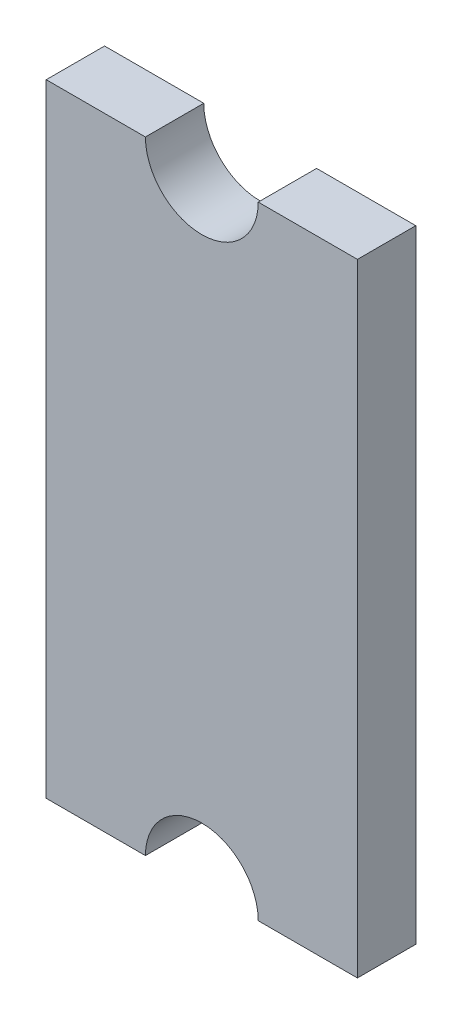
ISO-10303-21;
HEADER;
FILE_DESCRIPTION(('STEP AP214'),'2;1');
FILE_NAME('part.step','',(''),(''),'','','');
FILE_SCHEMA(('AUTOMOTIVE_DESIGN { 1 0 10303 214 1 1 1 1 }'));
ENDSEC;
DATA;
#1=APPLICATION_CONTEXT('core data for automotive mechanical design processes');
#2=APPLICATION_PROTOCOL_DEFINITION('international standard','automotive_design',2000,#1);
#3=PRODUCT_CONTEXT('',#1,'mechanical');
#4=PRODUCT('Part','Part','',(#3));
#5=PRODUCT_RELATED_PRODUCT_CATEGORY('part','',(#4));
#6=PRODUCT_DEFINITION_FORMATION('','',#4);
#7=PRODUCT_DEFINITION_CONTEXT('part definition',#1,'design');
#8=PRODUCT_DEFINITION('design','',#6,#7);
#9=PRODUCT_DEFINITION_SHAPE('','',#8);
#10=(LENGTH_UNIT() NAMED_UNIT(*) SI_UNIT(.MILLI.,.METRE.));
#11=(NAMED_UNIT(*) PLANE_ANGLE_UNIT() SI_UNIT($,.RADIAN.));
#12=(NAMED_UNIT(*) SI_UNIT($,.STERADIAN.) SOLID_ANGLE_UNIT());
#13=UNCERTAINTY_MEASURE_WITH_UNIT(LENGTH_MEASURE(1.E-05),#10,'distance_accuracy_value','');
#14=(GEOMETRIC_REPRESENTATION_CONTEXT(3) GLOBAL_UNCERTAINTY_ASSIGNED_CONTEXT((#13)) GLOBAL_UNIT_ASSIGNED_CONTEXT((#10,
#11,#12)) REPRESENTATION_CONTEXT('',''));
#15=CARTESIAN_POINT('',(0.,0.,0.));
#16=DIRECTION('',(0.,0.,1.));
#17=DIRECTION('',(1.,0.,0.));
#18=AXIS2_PLACEMENT_3D('',#15,#16,#17);
#19=CARTESIAN_POINT('',(0.,0.,0.15));
#20=DIRECTION('',(0.,0.,1.));
#21=DIRECTION('',(1.,0.,0.));
#22=AXIS2_PLACEMENT_3D('',#19,#20,#21);
#23=PLANE('',#22);
#24=DIRECTION('',(-1.,0.,0.));
#25=VECTOR('',#24,1.);
#26=CARTESIAN_POINT('',(-0.145,0.8,0.15));
#27=LINE('',#26,#25);
#28=CARTESIAN_POINT('',(-0.145,0.8,0.15));
#29=VERTEX_POINT('',#28);
#30=CARTESIAN_POINT('',(-0.4,0.8,0.15));
#31=VERTEX_POINT('',#30);
#32=EDGE_CURVE('E270',#29,#31,#27,.T.);
#33=ORIENTED_EDGE('',*,*,#32,.T.);
#34=DIRECTION('',(0.,-1.,0.));
#35=VECTOR('',#34,1.);
#36=CARTESIAN_POINT('',(-0.4,0.8,0.15));
#37=LINE('',#36,#35);
#38=CARTESIAN_POINT('',(-0.4,-0.8,0.15));
#39=VERTEX_POINT('',#38);
#40=EDGE_CURVE('E134',#31,#39,#37,.T.);
#41=ORIENTED_EDGE('',*,*,#40,.T.);
#42=DIRECTION('',(1.,0.,0.));
#43=VECTOR('',#42,1.);
#44=CARTESIAN_POINT('',(-0.4,-0.8,0.15));
#45=LINE('',#44,#43);
#46=CARTESIAN_POINT('',(-0.145,-0.8,0.15));
#47=VERTEX_POINT('',#46);
#48=EDGE_CURVE('E127',#39,#47,#45,.T.);
#49=ORIENTED_EDGE('',*,*,#48,.T.);
#50=CARTESIAN_POINT('',(0.,-0.8,0.15));
#51=DIRECTION('',(0.,0.,1.));
#52=DIRECTION('',(1.,0.,0.));
#53=AXIS2_PLACEMENT_3D('',#50,#51,#52);
#54=CIRCLE('',#53,0.145);
#55=CARTESIAN_POINT('',(0.145,-0.8,0.15));
#56=VERTEX_POINT('',#55);
#57=EDGE_CURVE('E118',#56,#47,#54,.T.);
#58=ORIENTED_EDGE('',*,*,#57,.F.);
#59=DIRECTION('',(1.,0.,0.));
#60=VECTOR('',#59,1.);
#61=CARTESIAN_POINT('',(0.145,-0.8,0.15));
#62=LINE('',#61,#60);
#63=CARTESIAN_POINT('',(0.4,-0.8,0.15));
#64=VERTEX_POINT('',#63);
#65=EDGE_CURVE('E150',#56,#64,#62,.T.);
#66=ORIENTED_EDGE('',*,*,#65,.T.);
#67=DIRECTION('',(0.,1.,0.));
#68=VECTOR('',#67,1.);
#69=CARTESIAN_POINT('',(0.4,-0.8,0.15));
#70=LINE('',#69,#68);
#71=CARTESIAN_POINT('',(0.4,0.8,0.15));
#72=VERTEX_POINT('',#71);
#73=EDGE_CURVE('E68',#64,#72,#70,.T.);
#74=ORIENTED_EDGE('',*,*,#73,.T.);
#75=DIRECTION('',(-1.,0.,0.));
#76=VECTOR('',#75,1.);
#77=CARTESIAN_POINT('',(0.4,0.8,0.15));
#78=LINE('',#77,#76);
#79=CARTESIAN_POINT('',(0.145,0.8,0.15));
#80=VERTEX_POINT('',#79);
#81=EDGE_CURVE('E166',#72,#80,#78,.T.);
#82=ORIENTED_EDGE('',*,*,#81,.T.);
#83=CARTESIAN_POINT('',(0.,0.8,0.15));
#84=DIRECTION('',(0.,0.,1.));
#85=DIRECTION('',(1.,0.,0.));
#86=AXIS2_PLACEMENT_3D('',#83,#84,#85);
#87=CIRCLE('',#86,0.145);
#88=EDGE_CURVE('E26',#29,#80,#87,.T.);
#89=ORIENTED_EDGE('',*,*,#88,.F.);
#90=EDGE_LOOP('',(#33,#41,#49,#58,#66,#74,#82,#89));
#91=FACE_BOUND('',#90,.T.);
#92=ADVANCED_FACE('F17',(#91),#23,.T.);
#93=CARTESIAN_POINT('',(0.,0.,0.));
#94=DIRECTION('',(0.,0.,1.));
#95=DIRECTION('',(1.,0.,0.));
#96=AXIS2_PLACEMENT_3D('',#93,#94,#95);
#97=PLANE('',#96);
#98=DIRECTION('',(-1.,0.,0.));
#99=VECTOR('',#98,1.);
#100=CARTESIAN_POINT('',(-0.145,0.8,0.));
#101=LINE('',#100,#99);
#102=CARTESIAN_POINT('',(-0.145,0.8,0.));
#103=VERTEX_POINT('',#102);
#104=CARTESIAN_POINT('',(-0.4,0.8,0.));
#105=VERTEX_POINT('',#104);
#106=EDGE_CURVE('E267',#103,#105,#101,.T.);
#107=ORIENTED_EDGE('',*,*,#106,.F.);
#108=CARTESIAN_POINT('',(0.,0.8,0.));
#109=DIRECTION('',(0.,0.,1.));
#110=DIRECTION('',(1.,0.,0.));
#111=AXIS2_PLACEMENT_3D('',#108,#109,#110);
#112=CIRCLE('',#111,0.145);
#113=CARTESIAN_POINT('',(0.145,0.8,0.));
#114=VERTEX_POINT('',#113);
#115=EDGE_CURVE('E11',#103,#114,#112,.T.);
#116=ORIENTED_EDGE('',*,*,#115,.T.);
#117=DIRECTION('',(-1.,0.,0.));
#118=VECTOR('',#117,1.);
#119=CARTESIAN_POINT('',(0.4,0.8,0.));
#120=LINE('',#119,#118);
#121=CARTESIAN_POINT('',(0.4,0.8,0.));
#122=VERTEX_POINT('',#121);
#123=EDGE_CURVE('E58',#122,#114,#120,.T.);
#124=ORIENTED_EDGE('',*,*,#123,.F.);
#125=DIRECTION('',(0.,1.,0.));
#126=VECTOR('',#125,1.);
#127=CARTESIAN_POINT('',(0.4,-0.8,0.));
#128=LINE('',#127,#126);
#129=CARTESIAN_POINT('',(0.4,-0.8,0.));
#130=VERTEX_POINT('',#129);
#131=EDGE_CURVE('E78',#130,#122,#128,.T.);
#132=ORIENTED_EDGE('',*,*,#131,.F.);
#133=DIRECTION('',(1.,0.,0.));
#134=VECTOR('',#133,1.);
#135=CARTESIAN_POINT('',(0.145,-0.8,0.));
#136=LINE('',#135,#134);
#137=CARTESIAN_POINT('',(0.145,-0.8,0.));
#138=VERTEX_POINT('',#137);
#139=EDGE_CURVE('E113',#138,#130,#136,.T.);
#140=ORIENTED_EDGE('',*,*,#139,.F.);
#141=CARTESIAN_POINT('',(0.,-0.8,0.));
#142=DIRECTION('',(0.,0.,1.));
#143=DIRECTION('',(1.,0.,0.));
#144=AXIS2_PLACEMENT_3D('',#141,#142,#143);
#145=CIRCLE('',#144,0.145);
#146=CARTESIAN_POINT('',(-0.145,-0.8,0.));
#147=VERTEX_POINT('',#146);
#148=EDGE_CURVE('E106',#138,#147,#145,.T.);
#149=ORIENTED_EDGE('',*,*,#148,.T.);
#150=DIRECTION('',(1.,0.,0.));
#151=VECTOR('',#150,1.);
#152=CARTESIAN_POINT('',(-0.4,-0.8,0.));
#153=LINE('',#152,#151);
#154=CARTESIAN_POINT('',(-0.4,-0.8,0.));
#155=VERTEX_POINT('',#154);
#156=EDGE_CURVE('E110',#155,#147,#153,.T.);
#157=ORIENTED_EDGE('',*,*,#156,.F.);
#158=DIRECTION('',(0.,-1.,0.));
#159=VECTOR('',#158,1.);
#160=CARTESIAN_POINT('',(-0.4,0.8,0.));
#161=LINE('',#160,#159);
#162=EDGE_CURVE('E264',#105,#155,#161,.T.);
#163=ORIENTED_EDGE('',*,*,#162,.F.);
#164=EDGE_LOOP('',(#107,#116,#124,#132,#140,#149,#157,#163));
#165=FACE_BOUND('',#164,.T.);
#166=ADVANCED_FACE('F19',(#165),#97,.F.);
#167=CARTESIAN_POINT('',(0.,0.8,0.));
#168=DIRECTION('',(0.,0.,-1.));
#169=DIRECTION('',(1.,0.,0.));
#170=AXIS2_PLACEMENT_3D('',#167,#168,#169);
#171=CYLINDRICAL_SURFACE('',#170,0.145);
#172=DIRECTION('',(0.,0.,1.));
#173=VECTOR('',#172,1.);
#174=CARTESIAN_POINT('',(-0.145,0.8,0.));
#175=LINE('',#174,#173);
#176=EDGE_CURVE('E277',#103,#29,#175,.T.);
#177=ORIENTED_EDGE('',*,*,#176,.T.);
#178=ORIENTED_EDGE('',*,*,#88,.T.);
#179=DIRECTION('',(0.,0.,1.));
#180=VECTOR('',#179,1.);
#181=CARTESIAN_POINT('',(0.145,0.8,0.));
#182=LINE('',#181,#180);
#183=EDGE_CURVE('E156',#114,#80,#182,.T.);
#184=ORIENTED_EDGE('',*,*,#183,.F.);
#185=ORIENTED_EDGE('',*,*,#115,.F.);
#186=EDGE_LOOP('',(#177,#178,#184,#185));
#187=FACE_BOUND('',#186,.T.);
#188=ADVANCED_FACE('F202',(#187),#171,.F.);
#189=CARTESIAN_POINT('',(0.4,0.8,0.));
#190=DIRECTION('',(0.,-1.,0.));
#191=DIRECTION('',(0.,0.,-1.));
#192=AXIS2_PLACEMENT_3D('',#189,#190,#191);
#193=PLANE('',#192);
#194=DIRECTION('',(0.,0.,1.));
#195=VECTOR('',#194,1.);
#196=CARTESIAN_POINT('',(0.4,0.8,0.));
#197=LINE('',#196,#195);
#198=EDGE_CURVE('E149',#122,#72,#197,.T.);
#199=ORIENTED_EDGE('',*,*,#198,.F.);
#200=ORIENTED_EDGE('',*,*,#123,.T.);
#201=ORIENTED_EDGE('',*,*,#183,.T.);
#202=ORIENTED_EDGE('',*,*,#81,.F.);
#203=EDGE_LOOP('',(#199,#200,#201,#202));
#204=FACE_BOUND('',#203,.T.);
#205=ADVANCED_FACE('F196',(#204),#193,.F.);
#206=CARTESIAN_POINT('',(0.4,-0.8,0.));
#207=DIRECTION('',(-1.,0.,0.));
#208=DIRECTION('',(0.,0.,1.));
#209=AXIS2_PLACEMENT_3D('',#206,#207,#208);
#210=PLANE('',#209);
#211=DIRECTION('',(0.,0.,1.));
#212=VECTOR('',#211,1.);
#213=CARTESIAN_POINT('',(0.4,-0.8,0.));
#214=LINE('',#213,#212);
#215=EDGE_CURVE('E146',#130,#64,#214,.T.);
#216=ORIENTED_EDGE('',*,*,#215,.F.);
#217=ORIENTED_EDGE('',*,*,#131,.T.);
#218=ORIENTED_EDGE('',*,*,#198,.T.);
#219=ORIENTED_EDGE('',*,*,#73,.F.);
#220=EDGE_LOOP('',(#216,#217,#218,#219));
#221=FACE_BOUND('',#220,.T.);
#222=ADVANCED_FACE('F201',(#221),#210,.F.);
#223=CARTESIAN_POINT('',(0.145,-0.8,0.));
#224=DIRECTION('',(0.,1.,0.));
#225=DIRECTION('',(1.,0.,0.));
#226=AXIS2_PLACEMENT_3D('',#223,#224,#225);
#227=PLANE('',#226);
#228=DIRECTION('',(0.,0.,1.));
#229=VECTOR('',#228,1.);
#230=CARTESIAN_POINT('',(0.145,-0.8,0.));
#231=LINE('',#230,#229);
#232=EDGE_CURVE('E287',#138,#56,#231,.T.);
#233=ORIENTED_EDGE('',*,*,#232,.F.);
#234=ORIENTED_EDGE('',*,*,#139,.T.);
#235=ORIENTED_EDGE('',*,*,#215,.T.);
#236=ORIENTED_EDGE('',*,*,#65,.F.);
#237=EDGE_LOOP('',(#233,#234,#235,#236));
#238=FACE_BOUND('',#237,.T.);
#239=ADVANCED_FACE('F227',(#238),#227,.F.);
#240=CARTESIAN_POINT('',(0.,-0.8,0.));
#241=DIRECTION('',(0.,0.,-1.));
#242=DIRECTION('',(1.,0.,0.));
#243=AXIS2_PLACEMENT_3D('',#240,#241,#242);
#244=CYLINDRICAL_SURFACE('',#243,0.145);
#245=ORIENTED_EDGE('',*,*,#232,.T.);
#246=ORIENTED_EDGE('',*,*,#57,.T.);
#247=DIRECTION('',(0.,0.,1.));
#248=VECTOR('',#247,1.);
#249=CARTESIAN_POINT('',(-0.145,-0.8,0.));
#250=LINE('',#249,#248);
#251=EDGE_CURVE('E121',#147,#47,#250,.T.);
#252=ORIENTED_EDGE('',*,*,#251,.F.);
#253=ORIENTED_EDGE('',*,*,#148,.F.);
#254=EDGE_LOOP('',(#245,#246,#252,#253));
#255=FACE_BOUND('',#254,.T.);
#256=ADVANCED_FACE('F122',(#255),#244,.F.);
#257=CARTESIAN_POINT('',(-0.4,-0.8,0.));
#258=DIRECTION('',(0.,1.,0.));
#259=DIRECTION('',(1.,0.,0.));
#260=AXIS2_PLACEMENT_3D('',#257,#258,#259);
#261=PLANE('',#260);
#262=DIRECTION('',(0.,0.,1.));
#263=VECTOR('',#262,1.);
#264=CARTESIAN_POINT('',(-0.4,-0.8,0.));
#265=LINE('',#264,#263);
#266=EDGE_CURVE('E131',#155,#39,#265,.T.);
#267=ORIENTED_EDGE('',*,*,#266,.F.);
#268=ORIENTED_EDGE('',*,*,#156,.T.);
#269=ORIENTED_EDGE('',*,*,#251,.T.);
#270=ORIENTED_EDGE('',*,*,#48,.F.);
#271=EDGE_LOOP('',(#267,#268,#269,#270));
#272=FACE_BOUND('',#271,.T.);
#273=ADVANCED_FACE('F129',(#272),#261,.F.);
#274=CARTESIAN_POINT('',(-0.4,0.8,0.));
#275=DIRECTION('',(1.,0.,0.));
#276=DIRECTION('',(0.,1.,0.));
#277=AXIS2_PLACEMENT_3D('',#274,#275,#276);
#278=PLANE('',#277);
#279=DIRECTION('',(0.,0.,1.));
#280=VECTOR('',#279,1.);
#281=CARTESIAN_POINT('',(-0.4,0.8,0.));
#282=LINE('',#281,#280);
#283=EDGE_CURVE('E272',#105,#31,#282,.T.);
#284=ORIENTED_EDGE('',*,*,#283,.F.);
#285=ORIENTED_EDGE('',*,*,#162,.T.);
#286=ORIENTED_EDGE('',*,*,#266,.T.);
#287=ORIENTED_EDGE('',*,*,#40,.F.);
#288=EDGE_LOOP('',(#284,#285,#286,#287));
#289=FACE_BOUND('',#288,.T.);
#290=ADVANCED_FACE('F190',(#289),#278,.F.);
#291=CARTESIAN_POINT('',(-0.145,0.8,0.));
#292=DIRECTION('',(0.,-1.,0.));
#293=DIRECTION('',(0.,0.,-1.));
#294=AXIS2_PLACEMENT_3D('',#291,#292,#293);
#295=PLANE('',#294);
#296=ORIENTED_EDGE('',*,*,#176,.F.);
#297=ORIENTED_EDGE('',*,*,#106,.T.);
#298=ORIENTED_EDGE('',*,*,#283,.T.);
#299=ORIENTED_EDGE('',*,*,#32,.F.);
#300=EDGE_LOOP('',(#296,#297,#298,#299));
#301=FACE_BOUND('',#300,.T.);
#302=ADVANCED_FACE('F185',(#301),#295,.F.);
#303=CLOSED_SHELL('',(#92,#166,#188,#205,#222,#239,#256,#273,#290,#302));
#304=MANIFOLD_SOLID_BREP('B1',#303);
#305=ADVANCED_BREP_SHAPE_REPRESENTATION('',(#18,#304),#14);
#306=SHAPE_DEFINITION_REPRESENTATION(#9,#305);
ENDSEC;
END-ISO-10303-21;
